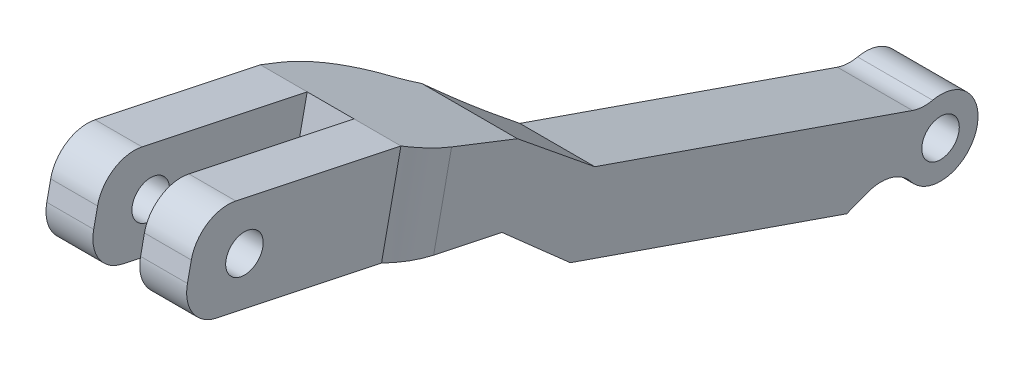
ISO-10303-21;
HEADER;
FILE_DESCRIPTION(('STEP AP214'),'2;1');
FILE_NAME('part.step','',(''),(''),'','','');
FILE_SCHEMA(('AUTOMOTIVE_DESIGN { 1 0 10303 214 1 1 1 1 }'));
ENDSEC;
DATA;
#1=APPLICATION_CONTEXT('core data for automotive mechanical design processes');
#2=APPLICATION_PROTOCOL_DEFINITION('international standard','automotive_design',2000,#1);
#3=PRODUCT_CONTEXT('',#1,'mechanical');
#4=PRODUCT('Part','Part','',(#3));
#5=PRODUCT_RELATED_PRODUCT_CATEGORY('part','',(#4));
#6=PRODUCT_DEFINITION_FORMATION('','',#4);
#7=PRODUCT_DEFINITION_CONTEXT('part definition',#1,'design');
#8=PRODUCT_DEFINITION('design','',#6,#7);
#9=PRODUCT_DEFINITION_SHAPE('','',#8);
#10=(LENGTH_UNIT() NAMED_UNIT(*) SI_UNIT(.MILLI.,.METRE.));
#11=(NAMED_UNIT(*) PLANE_ANGLE_UNIT() SI_UNIT($,.RADIAN.));
#12=(NAMED_UNIT(*) SI_UNIT($,.STERADIAN.) SOLID_ANGLE_UNIT());
#13=UNCERTAINTY_MEASURE_WITH_UNIT(LENGTH_MEASURE(1.E-05),#10,'distance_accuracy_value','');
#14=(GEOMETRIC_REPRESENTATION_CONTEXT(3) GLOBAL_UNCERTAINTY_ASSIGNED_CONTEXT((#13)) GLOBAL_UNIT_ASSIGNED_CONTEXT((#10,
#11,#12)) REPRESENTATION_CONTEXT('',''));
#15=CARTESIAN_POINT('',(0.,0.,0.));
#16=DIRECTION('',(0.,0.,1.));
#17=DIRECTION('',(1.,0.,0.));
#18=AXIS2_PLACEMENT_3D('',#15,#16,#17);
#19=CARTESIAN_POINT('',(-2.,0.,0.));
#20=DIRECTION('',(1.,0.,0.));
#21=DIRECTION('',(0.,0.,-1.));
#22=AXIS2_PLACEMENT_3D('',#19,#20,#21);
#23=PLANE('',#22);
#24=CARTESIAN_POINT('',(-2.,-2.82842712474619,-2.82842712474619));
#25=DIRECTION('',(1.,0.,0.));
#26=DIRECTION('',(0.,0.,-1.));
#27=AXIS2_PLACEMENT_3D('',#24,#25,#26);
#28=CIRCLE('',#27,1.);
#29=CARTESIAN_POINT('',(-2.,-2.82842712474619,-3.82842712474619));
#30=VERTEX_POINT('',#29);
#31=EDGE_CURVE('E330',#30,#30,#28,.T.);
#32=ORIENTED_EDGE('',*,*,#31,.T.);
#33=EDGE_LOOP('',(#32));
#34=FACE_BOUND('',#33,.T.);
#35=DIRECTION('',(0.,-0.662356527479229,-0.749188781620265));
#36=VECTOR('',#35,1.);
#37=CARTESIAN_POINT('',(-2.,-7.67349571635643,6.78412451040778));
#38=LINE('',#37,#36);
#39=CARTESIAN_POINT('',(-2.,2.12208722695251,17.8638686453186));
#40=VERTEX_POINT('',#39);
#41=CARTESIAN_POINT('',(-2.,1.2824807008123,16.9141931091639));
#42=VERTEX_POINT('',#41);
#43=EDGE_CURVE('E317',#40,#42,#38,.T.);
#44=ORIENTED_EDGE('',*,*,#43,.F.);
#45=DIRECTION('',(0.,0.978329833974477,-0.207052495651398));
#46=VECTOR('',#45,1.);
#47=CARTESIAN_POINT('',(-2.,3.70958131355781,17.5278933933648));
#48=LINE('',#47,#46);
#49=CARTESIAN_POINT('',(-2.,6.19815963643702,17.0012138069079));
#50=VERTEX_POINT('',#49);
#51=EDGE_CURVE('E373',#40,#50,#48,.T.);
#52=ORIENTED_EDGE('',*,*,#51,.T.);
#53=DIRECTION('',(0.,-0.63095563709956,-0.775818911868155));
#54=VECTOR('',#53,1.);
#55=CARTESIAN_POINT('',(-2.,-4.59157734088075,3.73422400780513));
#56=LINE('',#55,#54);
#57=CARTESIAN_POINT('',(-2.,5.06180407673865,15.6039584659886));
#58=VERTEX_POINT('',#57);
#59=EDGE_CURVE('E315',#50,#58,#56,.T.);
#60=ORIENTED_EDGE('',*,*,#59,.T.);
#61=DIRECTION('',(0.,0.32755866079382,0.944830843981587));
#62=VECTOR('',#61,1.);
#63=CARTESIAN_POINT('',(-2.,-0.310531053345477,0.107656451540146));
#64=LINE('',#63,#62);
#65=CARTESIAN_POINT('',(-2.,-0.808359955364981,-1.32831260668477));
#66=VERTEX_POINT('',#65);
#67=EDGE_CURVE('E312',#66,#58,#64,.T.);
#68=ORIENTED_EDGE('',*,*,#67,.F.);
#69=CARTESIAN_POINT('',(-2.,1.08130173259819,-1.98342992827241));
#70=DIRECTION('',(1.,0.,0.));
#71=DIRECTION('',(0.,0.,-1.));
#72=AXIS2_PLACEMENT_3D('',#69,#70,#71);
#73=CIRCLE('',#72,2.);
#74=CARTESIAN_POINT('',(-2.,-0.873562696074001,-2.40592852650929));
#75=VERTEX_POINT('',#74);
#76=EDGE_CURVE('E310',#66,#75,#73,.T.);
#77=ORIENTED_EDGE('',*,*,#76,.T.);
#78=CARTESIAN_POINT('',(-2.,-2.82842712474619,-2.82842712474619));
#79=DIRECTION('',(1.,0.,0.));
#80=DIRECTION('',(0.,0.,-1.));
#81=AXIS2_PLACEMENT_3D('',#78,#79,#80);
#82=CIRCLE('',#81,2.);
#83=CARTESIAN_POINT('',(-2.,-4.04939250373779,-1.24436792657716));
#84=VERTEX_POINT('',#83);
#85=EDGE_CURVE('E327',#84,#75,#82,.T.);
#86=ORIENTED_EDGE('',*,*,#85,.F.);
#87=CARTESIAN_POINT('',(-2.,-5.2703578827294,0.339691271591866));
#88=DIRECTION('',(1.,0.,0.));
#89=DIRECTION('',(0.,0.,-1.));
#90=AXIS2_PLACEMENT_3D('',#87,#88,#89);
#91=CIRCLE('',#90,2.);
#92=CARTESIAN_POINT('',(-2.,-3.40169175008281,1.05249340732073));
#93=VERTEX_POINT('',#92);
#94=EDGE_CURVE('E325',#84,#93,#91,.T.);
#95=ORIENTED_EDGE('',*,*,#94,.T.);
#96=DIRECTION('',(0.,0.356401067864434,-0.934333066323295));
#97=VECTOR('',#96,1.);
#98=CARTESIAN_POINT('',(-2.,-2.61912554346116,-0.999064652858577));
#99=LINE('',#98,#97);
#100=CARTESIAN_POINT('',(-2.,-3.8285642774204,2.17157287525382));
#101=VERTEX_POINT('',#100);
#102=EDGE_CURVE('E322',#101,#93,#99,.T.);
#103=ORIENTED_EDGE('',*,*,#102,.F.);
#104=DIRECTION('',(0.,0.32755866079382,0.944830843981588));
#105=VECTOR('',#104,1.);
#106=CARTESIAN_POINT('',(-2.,-4.08985442927183,1.41789109471543));
#107=LINE('',#106,#105);
#108=EDGE_CURVE('E319',#101,#42,#107,.T.);
#109=ORIENTED_EDGE('',*,*,#108,.T.);
#110=EDGE_LOOP('',(#44,#52,#60,#68,#77,#86,#95,#103,#109));
#111=FACE_BOUND('',#110,.T.);
#112=ADVANCED_FACE('F39',(#34,#111),#23,.F.);
#113=CARTESIAN_POINT('',(-2.,5.5996261759702,26.4584173681224));
#114=DIRECTION('',(0.,0.207052495651399,0.978329833974477));
#115=DIRECTION('',(0.,-0.978329833974477,0.207052495651399));
#116=AXIS2_PLACEMENT_3D('',#113,#114,#115);
#117=PLANE('',#116);
#118=DIRECTION('',(1.,0.,0.));
#119=VECTOR('',#118,1.);
#120=CARTESIAN_POINT('',(-2.,5.74583297997471,26.427474344002));
#121=LINE('',#120,#119);
#122=CARTESIAN_POINT('',(-3.55,5.7458329799747,26.427474344002));
#123=VERTEX_POINT('',#122);
#124=CARTESIAN_POINT('',(-1.05,5.7458329799747,26.427474344002));
#125=VERTEX_POINT('',#124);
#126=EDGE_CURVE('E347',#123,#125,#121,.T.);
#127=ORIENTED_EDGE('',*,*,#126,.T.);
#128=DIRECTION('',(0.,0.978329833974477,-0.207052495651399));
#129=VECTOR('',#128,1.);
#130=CARTESIAN_POINT('',(-1.05,5.5996261759702,26.4584173681224));
#131=LINE('',#130,#129);
#132=CARTESIAN_POINT('',(-1.05,10.6374821498471,25.392211865745));
#133=VERTEX_POINT('',#132);
#134=EDGE_CURVE('E272',#125,#133,#131,.T.);
#135=ORIENTED_EDGE('',*,*,#134,.T.);
#136=DIRECTION('',(1.,0.,0.));
#137=VECTOR('',#136,1.);
#138=CARTESIAN_POINT('',(-2.,10.6374821498471,25.392211865745));
#139=LINE('',#138,#137);
#140=CARTESIAN_POINT('',(-3.55,10.6374821498471,25.392211865745));
#141=VERTEX_POINT('',#140);
#142=EDGE_CURVE('E350',#141,#133,#139,.T.);
#143=ORIENTED_EDGE('',*,*,#142,.F.);
#144=DIRECTION('',(0.,-0.978329833974477,0.207052495651399));
#145=VECTOR('',#144,1.);
#146=CARTESIAN_POINT('',(-3.55,5.5996261759702,26.4584173681224));
#147=LINE('',#146,#145);
#148=EDGE_CURVE('E217',#141,#123,#147,.T.);
#149=ORIENTED_EDGE('',*,*,#148,.T.);
#150=EDGE_LOOP('',(#127,#135,#143,#149));
#151=FACE_BOUND('',#150,.T.);
#152=ADVANCED_FACE('F493',(#151),#117,.T.);
#153=CARTESIAN_POINT('',(-2.,1.08130173259819,-1.98342992827241));
#154=DIRECTION('',(1.,0.,0.));
#155=DIRECTION('',(0.,0.,-1.));
#156=AXIS2_PLACEMENT_3D('',#153,#154,#155);
#157=CYLINDRICAL_SURFACE('',#156,2.);
#158=DIRECTION('',(1.,0.,0.));
#159=VECTOR('',#158,1.);
#160=CARTESIAN_POINT('',(-2.,-0.808359955364981,-1.32831260668477));
#161=LINE('',#160,#159);
#162=CARTESIAN_POINT('',(2.,-0.808359955364981,-1.32831260668477));
#163=VERTEX_POINT('',#162);
#164=EDGE_CURVE('E333',#66,#163,#161,.T.);
#165=ORIENTED_EDGE('',*,*,#164,.T.);
#166=CARTESIAN_POINT('',(2.,1.08130173259819,-1.98342992827241));
#167=DIRECTION('',(1.,0.,0.));
#168=DIRECTION('',(0.,0.,-1.));
#169=AXIS2_PLACEMENT_3D('',#166,#167,#168);
#170=CIRCLE('',#169,2.);
#171=CARTESIAN_POINT('',(2.,-0.873562696074001,-2.40592852650929));
#172=VERTEX_POINT('',#171);
#173=EDGE_CURVE('E278',#163,#172,#170,.T.);
#174=ORIENTED_EDGE('',*,*,#173,.T.);
#175=DIRECTION('',(1.,0.,0.));
#176=VECTOR('',#175,1.);
#177=CARTESIAN_POINT('',(-2.,-0.873562696074001,-2.40592852650929));
#178=LINE('',#177,#176);
#179=EDGE_CURVE('E334',#75,#172,#178,.T.);
#180=ORIENTED_EDGE('',*,*,#179,.F.);
#181=ORIENTED_EDGE('',*,*,#76,.F.);
#182=EDGE_LOOP('',(#165,#174,#180,#181));
#183=FACE_BOUND('',#182,.T.);
#184=ADVANCED_FACE('F472',(#183),#157,.F.);
#185=CARTESIAN_POINT('',(-2.,-2.82842712474619,-2.82842712474619));
#186=DIRECTION('',(1.,0.,0.));
#187=DIRECTION('',(0.,0.,-1.));
#188=AXIS2_PLACEMENT_3D('',#185,#186,#187);
#189=CYLINDRICAL_SURFACE('',#188,2.);
#190=ORIENTED_EDGE('',*,*,#179,.T.);
#191=CARTESIAN_POINT('',(2.,-2.82842712474619,-2.82842712474619));
#192=DIRECTION('',(1.,0.,0.));
#193=DIRECTION('',(0.,0.,-1.));
#194=AXIS2_PLACEMENT_3D('',#191,#192,#193);
#195=CIRCLE('',#194,2.);
#196=CARTESIAN_POINT('',(2.,-4.04939250373779,-1.24436792657716));
#197=VERTEX_POINT('',#196);
#198=EDGE_CURVE('E304',#197,#172,#195,.T.);
#199=ORIENTED_EDGE('',*,*,#198,.F.);
#200=DIRECTION('',(1.,0.,0.));
#201=VECTOR('',#200,1.);
#202=CARTESIAN_POINT('',(-2.,-4.04939250373779,-1.24436792657716));
#203=LINE('',#202,#201);
#204=EDGE_CURVE('E337',#84,#197,#203,.T.);
#205=ORIENTED_EDGE('',*,*,#204,.F.);
#206=ORIENTED_EDGE('',*,*,#85,.T.);
#207=EDGE_LOOP('',(#190,#199,#205,#206));
#208=FACE_BOUND('',#207,.T.);
#209=ADVANCED_FACE('F468',(#208),#189,.T.);
#210=CARTESIAN_POINT('',(-2.,-5.2703578827294,0.339691271591866));
#211=DIRECTION('',(1.,0.,0.));
#212=DIRECTION('',(0.,0.,-1.));
#213=AXIS2_PLACEMENT_3D('',#210,#211,#212);
#214=CYLINDRICAL_SURFACE('',#213,2.);
#215=ORIENTED_EDGE('',*,*,#204,.T.);
#216=CARTESIAN_POINT('',(2.,-5.2703578827294,0.339691271591866));
#217=DIRECTION('',(1.,0.,0.));
#218=DIRECTION('',(0.,0.,-1.));
#219=AXIS2_PLACEMENT_3D('',#216,#217,#218);
#220=CIRCLE('',#219,2.);
#221=CARTESIAN_POINT('',(2.,-3.40169175008281,1.05249340732073));
#222=VERTEX_POINT('',#221);
#223=EDGE_CURVE('E301',#197,#222,#220,.T.);
#224=ORIENTED_EDGE('',*,*,#223,.T.);
#225=DIRECTION('',(1.,0.,0.));
#226=VECTOR('',#225,1.);
#227=CARTESIAN_POINT('',(-2.,-3.40169175008281,1.05249340732073));
#228=LINE('',#227,#226);
#229=EDGE_CURVE('E339',#93,#222,#228,.T.);
#230=ORIENTED_EDGE('',*,*,#229,.F.);
#231=ORIENTED_EDGE('',*,*,#94,.F.);
#232=EDGE_LOOP('',(#215,#224,#230,#231));
#233=FACE_BOUND('',#232,.T.);
#234=ADVANCED_FACE('F463',(#233),#214,.F.);
#235=CARTESIAN_POINT('',(-2.,-2.61912554346116,-0.999064652858577));
#236=DIRECTION('',(0.,-0.934333066323295,-0.356401067864434));
#237=DIRECTION('',(0.,0.356401067864434,-0.934333066323295));
#238=AXIS2_PLACEMENT_3D('',#235,#236,#237);
#239=PLANE('',#238);
#240=ORIENTED_EDGE('',*,*,#229,.T.);
#241=DIRECTION('',(0.,0.356401067864434,-0.934333066323295));
#242=VECTOR('',#241,1.);
#243=CARTESIAN_POINT('',(2.,-2.61912554346116,-0.999064652858577));
#244=LINE('',#243,#242);
#245=CARTESIAN_POINT('',(2.,-3.8285642774204,2.17157287525382));
#246=VERTEX_POINT('',#245);
#247=EDGE_CURVE('E298',#246,#222,#244,.T.);
#248=ORIENTED_EDGE('',*,*,#247,.F.);
#249=DIRECTION('',(1.,0.,0.));
#250=VECTOR('',#249,1.);
#251=CARTESIAN_POINT('',(-2.,-3.8285642774204,2.17157287525382));
#252=LINE('',#251,#250);
#253=EDGE_CURVE('E341',#101,#246,#252,.T.);
#254=ORIENTED_EDGE('',*,*,#253,.F.);
#255=ORIENTED_EDGE('',*,*,#102,.T.);
#256=EDGE_LOOP('',(#240,#248,#254,#255));
#257=FACE_BOUND('',#256,.T.);
#258=ADVANCED_FACE('F459',(#257),#239,.T.);
#259=CARTESIAN_POINT('',(-2.,-4.08985442927183,1.41789109471543));
#260=DIRECTION('',(0.,0.944830843981588,-0.32755866079382));
#261=DIRECTION('',(0.,0.32755866079382,0.944830843981588));
#262=AXIS2_PLACEMENT_3D('',#259,#260,#261);
#263=PLANE('',#262);
#264=ORIENTED_EDGE('',*,*,#253,.T.);
#265=DIRECTION('',(0.,0.32755866079382,0.944830843981588));
#266=VECTOR('',#265,1.);
#267=CARTESIAN_POINT('',(2.,-4.08985442927183,1.41789109471543));
#268=LINE('',#267,#266);
#269=CARTESIAN_POINT('',(2.,1.2824807008123,16.9141931091639));
#270=VERTEX_POINT('',#269);
#271=EDGE_CURVE('E295',#246,#270,#268,.T.);
#272=ORIENTED_EDGE('',*,*,#271,.T.);
#273=DIRECTION('',(1.,0.,0.));
#274=VECTOR('',#273,1.);
#275=CARTESIAN_POINT('',(-2.,1.2824807008123,16.9141931091639));
#276=LINE('',#275,#274);
#277=EDGE_CURVE('E343',#42,#270,#276,.T.);
#278=ORIENTED_EDGE('',*,*,#277,.F.);
#279=ORIENTED_EDGE('',*,*,#108,.F.);
#280=EDGE_LOOP('',(#264,#272,#278,#279));
#281=FACE_BOUND('',#280,.T.);
#282=ADVANCED_FACE('F454',(#281),#263,.F.);
#283=CARTESIAN_POINT('',(-2.,-7.67349571635643,6.78412451040778));
#284=DIRECTION('',(0.,-0.749188781620265,0.662356527479229));
#285=DIRECTION('',(0.,-0.662356527479229,-0.749188781620265));
#286=AXIS2_PLACEMENT_3D('',#283,#284,#285);
#287=PLANE('',#286);
#288=ORIENTED_EDGE('',*,*,#277,.T.);
#289=DIRECTION('',(0.,-0.662356527479229,-0.749188781620265));
#290=VECTOR('',#289,1.);
#291=CARTESIAN_POINT('',(2.,-7.67349571635643,6.78412451040778));
#292=LINE('',#291,#290);
#293=CARTESIAN_POINT('',(2.,4.50351800606632,20.5574953401551));
#294=VERTEX_POINT('',#293);
#295=EDGE_CURVE('E292',#294,#270,#292,.T.);
#296=ORIENTED_EDGE('',*,*,#295,.F.);
#297=DIRECTION('',(1.,0.,0.));
#298=VECTOR('',#297,1.);
#299=CARTESIAN_POINT('',(-2.,4.50351800606632,20.5574953401551));
#300=LINE('',#299,#298);
#301=CARTESIAN_POINT('',(-3.09954996537938,4.50351800606632,20.5574953401551));
#302=VERTEX_POINT('',#301);
#303=EDGE_CURVE('E345',#302,#294,#300,.T.);
#304=ORIENTED_EDGE('',*,*,#303,.F.);
#305=CARTESIAN_POINT('',(-7.,2.12208722695251,17.8638686453186));
#306=DIRECTION('',(0.,-0.749188781620265,0.662356527479229));
#307=DIRECTION('',(0.,0.662356527479229,0.749188781620265));
#308=AXIS2_PLACEMENT_3D('',#305,#306,#307);
#309=ELLIPSE('',#308,5.74649030450801,5.);
#310=EDGE_CURVE('E378',#302,#40,#309,.F.);
#311=ORIENTED_EDGE('',*,*,#310,.T.);
#312=ORIENTED_EDGE('',*,*,#43,.T.);
#313=EDGE_LOOP('',(#288,#296,#304,#311,#312));
#314=FACE_BOUND('',#313,.T.);
#315=ADVANCED_FACE('F450',(#314),#287,.T.);
#316=CARTESIAN_POINT('',(-2.,0.146206804004553,-0.0309430241203779));
#317=DIRECTION('',(0.,0.978329833974477,-0.207052495651397));
#318=DIRECTION('',(0.,0.207052495651397,0.978329833974477));
#319=AXIS2_PLACEMENT_3D('',#316,#317,#318);
#320=PLANE('',#319);
#321=DIRECTION('',(0.,0.207052495651397,0.978329833974477));
#322=VECTOR('',#321,1.);
#323=CARTESIAN_POINT('',(-3.55,0.146206804004553,-0.0309430241203779));
#324=LINE('',#323,#322);
#325=CARTESIAN_POINT('',(-3.55,7.60930544083729,35.2324428497723));
#326=VERTEX_POINT('',#325);
#327=EDGE_CURVE('E240',#123,#326,#324,.T.);
#328=ORIENTED_EDGE('',*,*,#327,.T.);
#329=DIRECTION('',(1.,0.,0.));
#330=VECTOR('',#329,1.);
#331=CARTESIAN_POINT('',(-6.05,7.60930544083729,35.2324428497723));
#332=LINE('',#331,#330);
#333=CARTESIAN_POINT('',(-6.05,7.60930544083729,35.2324428497723));
#334=VERTEX_POINT('',#333);
#335=EDGE_CURVE('E397',#326,#334,#332,.F.);
#336=ORIENTED_EDGE('',*,*,#335,.T.);
#337=DIRECTION('',(0.,0.207052495651397,0.978329833974477));
#338=VECTOR('',#337,1.);
#339=CARTESIAN_POINT('',(-6.05,0.146206804004553,-0.0309430241203779));
#340=LINE('',#339,#338);
#341=CARTESIAN_POINT('',(-6.05,5.5199222365214,25.3600386705492));
#342=VERTEX_POINT('',#341);
#343=EDGE_CURVE('E236',#342,#334,#340,.T.);
#344=ORIENTED_EDGE('',*,*,#343,.F.);
#345=CARTESIAN_POINT('',(-1.05,5.5199222365214,25.3600386705492));
#346=DIRECTION('',(0.,0.978329833974477,-0.207052495651397));
#347=DIRECTION('',(0.,0.207052495651397,0.978329833974477));
#348=AXIS2_PLACEMENT_3D('',#345,#346,#347);
#349=CIRCLE('',#348,5.);
#350=CARTESIAN_POINT('',(-4.025,4.68785517704188,21.4284945198968));
#351=VERTEX_POINT('',#350);
#352=EDGE_CURVE('E366',#342,#351,#349,.F.);
#353=ORIENTED_EDGE('',*,*,#352,.T.);
#354=CARTESIAN_POINT('',(-7.,3.85578811756236,17.4969503692444));
#355=DIRECTION('',(0.,0.978329833974477,-0.207052495651397));
#356=DIRECTION('',(0.,0.207052495651397,0.978329833974477));
#357=AXIS2_PLACEMENT_3D('',#354,#355,#356);
#358=CIRCLE('',#357,5.);
#359=EDGE_CURVE('E375',#351,#302,#358,.T.);
#360=ORIENTED_EDGE('',*,*,#359,.T.);
#361=ORIENTED_EDGE('',*,*,#303,.T.);
#362=DIRECTION('',(0.,0.207052495651397,0.978329833974477));
#363=VECTOR('',#362,1.);
#364=CARTESIAN_POINT('',(2.,0.146206804004553,-0.0309430241203779));
#365=LINE('',#364,#363);
#366=CARTESIAN_POINT('',(2.,5.27379415728258,24.197075422313));
#367=VERTEX_POINT('',#366);
#368=EDGE_CURVE('E289',#294,#367,#365,.T.);
#369=ORIENTED_EDGE('',*,*,#368,.T.);
#370=CARTESIAN_POINT('',(-3.,5.27379415728258,24.197075422313));
#371=DIRECTION('',(0.,0.978329833974477,-0.207052495651397));
#372=DIRECTION('',(0.,0.207052495651397,0.978329833974477));
#373=AXIS2_PLACEMENT_3D('',#370,#371,#372);
#374=CIRCLE('',#373,5.);
#375=CARTESIAN_POINT('',(1.45,5.7458329799747,26.427474344002));
#376=VERTEX_POINT('',#375);
#377=EDGE_CURVE('E360',#367,#376,#374,.F.);
#378=ORIENTED_EDGE('',*,*,#377,.T.);
#379=DIRECTION('',(0.,0.207052495651397,0.978329833974477));
#380=VECTOR('',#379,1.);
#381=CARTESIAN_POINT('',(1.45,0.146206804004553,-0.0309430241203779));
#382=LINE('',#381,#380);
#383=CARTESIAN_POINT('',(1.45,7.60930544083728,35.2324428497723));
#384=VERTEX_POINT('',#383);
#385=EDGE_CURVE('E251',#376,#384,#382,.T.);
#386=ORIENTED_EDGE('',*,*,#385,.T.);
#387=DIRECTION('',(-1.,0.,0.));
#388=VECTOR('',#387,1.);
#389=CARTESIAN_POINT('',(-2.,7.60930544083728,35.2324428497723));
#390=LINE('',#389,#388);
#391=CARTESIAN_POINT('',(-1.05,7.60930544083728,35.2324428497723));
#392=VERTEX_POINT('',#391);
#393=EDGE_CURVE('E394',#384,#392,#390,.T.);
#394=ORIENTED_EDGE('',*,*,#393,.T.);
#395=DIRECTION('',(0.,0.207052495651397,0.978329833974477));
#396=VECTOR('',#395,1.);
#397=CARTESIAN_POINT('',(-1.05,0.146206804004553,-0.0309430241203779));
#398=LINE('',#397,#396);
#399=EDGE_CURVE('E250',#125,#392,#398,.T.);
#400=ORIENTED_EDGE('',*,*,#399,.F.);
#401=ORIENTED_EDGE('',*,*,#126,.F.);
#402=EDGE_LOOP('',(#328,#336,#344,#353,#360,#361,#369,#378,#386,#394,#400,#401));
#403=FACE_BOUND('',#402,.T.);
#404=ADVANCED_FACE('F422',(#403),#320,.F.);
#405=CARTESIAN_POINT('',(-2.,0.58958659493355,-0.23119890553793));
#406=DIRECTION('',(0.,-0.930979383131998,0.365071757580842));
#407=DIRECTION('',(0.,-0.365071757580842,-0.930979383131998));
#408=AXIS2_PLACEMENT_3D('',#405,#406,#407);
#409=PLANE('',#408);
#410=DIRECTION('',(1.,0.,0.));
#411=VECTOR('',#410,1.);
#412=CARTESIAN_POINT('',(-2.,8.41683734196423,19.7292853575495));
#413=LINE('',#412,#411);
#414=CARTESIAN_POINT('',(-3.09954996537938,8.41683734196423,19.7292853575495));
#415=VERTEX_POINT('',#414);
#416=CARTESIAN_POINT('',(2.,8.41683734196423,19.7292853575495));
#417=VERTEX_POINT('',#416);
#418=EDGE_CURVE('E352',#415,#417,#413,.T.);
#419=ORIENTED_EDGE('',*,*,#418,.F.);
#420=CARTESIAN_POINT('',(-7.,7.25901662497515,16.7766953680562));
#421=DIRECTION('',(0.,-0.930979383131998,0.365071757580842));
#422=DIRECTION('',(0.,0.365071757580842,0.930979383131998));
#423=AXIS2_PLACEMENT_3D('',#420,#421,#422);
#424=ELLIPSE('',#423,5.06896877524852,5.);
#425=CARTESIAN_POINT('',(-4.025,8.74634104289674,20.569561675462));
#426=VERTEX_POINT('',#425);
#427=EDGE_CURVE('E383',#415,#426,#424,.T.);
#428=ORIENTED_EDGE('',*,*,#427,.T.);
#429=CARTESIAN_POINT('',(-1.05,10.2336654608183,24.3624279828678));
#430=DIRECTION('',(0.,-0.930979383131998,0.365071757580842));
#431=DIRECTION('',(0.,0.365071757580842,0.930979383131998));
#432=AXIS2_PLACEMENT_3D('',#429,#430,#431);
#433=ELLIPSE('',#432,5.06896877524852,5.);
#434=CARTESIAN_POINT('',(-6.05,10.2336654608183,24.3624279828678));
#435=VERTEX_POINT('',#434);
#436=EDGE_CURVE('E223',#426,#435,#433,.F.);
#437=ORIENTED_EDGE('',*,*,#436,.T.);
#438=DIRECTION('',(0.,-0.365071757580842,-0.930979383131998));
#439=VECTOR('',#438,1.);
#440=CARTESIAN_POINT('',(-6.05,0.58958659493355,-0.23119890553793));
#441=LINE('',#440,#439);
#442=CARTESIAN_POINT('',(-6.05,10.6374821498471,25.392211865745));
#443=VERTEX_POINT('',#442);
#444=EDGE_CURVE('E218',#443,#435,#441,.T.);
#445=ORIENTED_EDGE('',*,*,#444,.F.);
#446=DIRECTION('',(1.,0.,0.));
#447=VECTOR('',#446,1.);
#448=CARTESIAN_POINT('',(-6.05,10.6374821498471,25.392211865745));
#449=LINE('',#448,#447);
#450=EDGE_CURVE('E206',#443,#141,#449,.T.);
#451=ORIENTED_EDGE('',*,*,#450,.T.);
#452=ORIENTED_EDGE('',*,*,#142,.T.);
#453=DIRECTION('',(-1.,0.,0.));
#454=VECTOR('',#453,1.);
#455=CARTESIAN_POINT('',(1.45,10.6374821498471,25.392211865745));
#456=LINE('',#455,#454);
#457=CARTESIAN_POINT('',(1.45,10.6374821498471,25.392211865745));
#458=VERTEX_POINT('',#457);
#459=EDGE_CURVE('E262',#458,#133,#456,.T.);
#460=ORIENTED_EDGE('',*,*,#459,.F.);
#461=CARTESIAN_POINT('',(-3.,9.79371017354013,23.2404860811713));
#462=DIRECTION('',(0.,-0.930979383131998,0.365071757580842));
#463=DIRECTION('',(0.,0.365071757580842,0.930979383131998));
#464=AXIS2_PLACEMENT_3D('',#461,#462,#463);
#465=ELLIPSE('',#464,5.06896877524851,5.);
#466=CARTESIAN_POINT('',(2.,9.79371017354013,23.2404860811713));
#467=VERTEX_POINT('',#466);
#468=EDGE_CURVE('E362',#458,#467,#465,.F.);
#469=ORIENTED_EDGE('',*,*,#468,.T.);
#470=DIRECTION('',(0.,-0.365071757580842,-0.930979383131998));
#471=VECTOR('',#470,1.);
#472=CARTESIAN_POINT('',(2.,0.58958659493355,-0.23119890553793));
#473=LINE('',#472,#471);
#474=EDGE_CURVE('E287',#467,#417,#473,.T.);
#475=ORIENTED_EDGE('',*,*,#474,.T.);
#476=EDGE_LOOP('',(#419,#428,#437,#445,#451,#452,#460,#469,#475));
#477=FACE_BOUND('',#476,.T.);
#478=ADVANCED_FACE('F221',(#477),#409,.F.);
#479=CARTESIAN_POINT('',(-2.,-4.59157734088075,3.73422400780513));
#480=DIRECTION('',(0.,-0.775818911868155,0.63095563709956));
#481=DIRECTION('',(0.,-0.63095563709956,-0.775818911868155));
#482=AXIS2_PLACEMENT_3D('',#479,#480,#481);
#483=PLANE('',#482);
#484=ORIENTED_EDGE('',*,*,#418,.T.);
#485=DIRECTION('',(0.,-0.63095563709956,-0.775818911868155));
#486=VECTOR('',#485,1.);
#487=CARTESIAN_POINT('',(2.,-4.59157734088075,3.73422400780513));
#488=LINE('',#487,#486);
#489=CARTESIAN_POINT('',(2.,5.06180407673865,15.6039584659886));
#490=VERTEX_POINT('',#489);
#491=EDGE_CURVE('E284',#417,#490,#488,.T.);
#492=ORIENTED_EDGE('',*,*,#491,.T.);
#493=DIRECTION('',(1.,0.,0.));
#494=VECTOR('',#493,1.);
#495=CARTESIAN_POINT('',(-2.,5.06180407673865,15.6039584659886));
#496=LINE('',#495,#494);
#497=EDGE_CURVE('E355',#58,#490,#496,.T.);
#498=ORIENTED_EDGE('',*,*,#497,.F.);
#499=ORIENTED_EDGE('',*,*,#59,.F.);
#500=CARTESIAN_POINT('',(-7.,6.19815963643702,17.0012138069079));
#501=DIRECTION('',(0.,-0.775818911868155,0.63095563709956));
#502=DIRECTION('',(0.,0.63095563709956,0.775818911868155));
#503=AXIS2_PLACEMENT_3D('',#500,#501,#502);
#504=ELLIPSE('',#503,5.6202020763828,5.);
#505=EDGE_CURVE('E380',#50,#415,#504,.T.);
#506=ORIENTED_EDGE('',*,*,#505,.T.);
#507=EDGE_LOOP('',(#484,#492,#498,#499,#506));
#508=FACE_BOUND('',#507,.T.);
#509=ADVANCED_FACE('F480',(#508),#483,.F.);
#510=CARTESIAN_POINT('',(-2.,-0.310531053345477,0.107656451540146));
#511=DIRECTION('',(0.,0.944830843981587,-0.32755866079382));
#512=DIRECTION('',(0.,0.32755866079382,0.944830843981587));
#513=AXIS2_PLACEMENT_3D('',#510,#511,#512);
#514=PLANE('',#513);
#515=ORIENTED_EDGE('',*,*,#497,.T.);
#516=DIRECTION('',(0.,0.32755866079382,0.944830843981587));
#517=VECTOR('',#516,1.);
#518=CARTESIAN_POINT('',(2.,-0.310531053345477,0.107656451540146));
#519=LINE('',#518,#517);
#520=EDGE_CURVE('E281',#163,#490,#519,.T.);
#521=ORIENTED_EDGE('',*,*,#520,.F.);
#522=ORIENTED_EDGE('',*,*,#164,.F.);
#523=ORIENTED_EDGE('',*,*,#67,.T.);
#524=EDGE_LOOP('',(#515,#521,#522,#523));
#525=FACE_BOUND('',#524,.T.);
#526=ADVANCED_FACE('F477',(#525),#514,.T.);
#527=CARTESIAN_POINT('',(-2.,-2.82842712474619,-2.82842712474619));
#528=DIRECTION('',(1.,0.,0.));
#529=DIRECTION('',(0.,0.,-1.));
#530=AXIS2_PLACEMENT_3D('',#527,#528,#529);
#531=CYLINDRICAL_SURFACE('',#530,1.);
#532=ORIENTED_EDGE('',*,*,#31,.F.);
#533=EDGE_LOOP('',(#532));
#534=FACE_BOUND('',#533,.T.);
#535=CARTESIAN_POINT('',(2.,-2.82842712474619,-2.82842712474619));
#536=DIRECTION('',(1.,0.,0.));
#537=DIRECTION('',(0.,0.,-1.));
#538=AXIS2_PLACEMENT_3D('',#535,#536,#537);
#539=CIRCLE('',#538,1.);
#540=CARTESIAN_POINT('',(2.,-2.82842712474619,-3.82842712474619));
#541=VERTEX_POINT('',#540);
#542=EDGE_CURVE('E307',#541,#541,#539,.T.);
#543=ORIENTED_EDGE('',*,*,#542,.T.);
#544=EDGE_LOOP('',(#543));
#545=FACE_BOUND('',#544,.T.);
#546=ADVANCED_FACE('F504',(#534,#545),#531,.F.);
#547=CARTESIAN_POINT('',(2.,0.,0.));
#548=DIRECTION('',(1.,0.,0.));
#549=DIRECTION('',(0.,0.,-1.));
#550=AXIS2_PLACEMENT_3D('',#547,#548,#549);
#551=PLANE('',#550);
#552=ORIENTED_EDGE('',*,*,#474,.F.);
#553=DIRECTION('',(0.,-0.978329833974477,0.207052495651399));
#554=VECTOR('',#553,1.);
#555=CARTESIAN_POINT('',(2.,5.27379415728258,24.197075422313));
#556=LINE('',#555,#554);
#557=EDGE_CURVE('E336',#467,#367,#556,.T.);
#558=ORIENTED_EDGE('',*,*,#557,.T.);
#559=ORIENTED_EDGE('',*,*,#368,.F.);
#560=ORIENTED_EDGE('',*,*,#295,.T.);
#561=ORIENTED_EDGE('',*,*,#271,.F.);
#562=ORIENTED_EDGE('',*,*,#247,.T.);
#563=ORIENTED_EDGE('',*,*,#223,.F.);
#564=ORIENTED_EDGE('',*,*,#198,.T.);
#565=ORIENTED_EDGE('',*,*,#173,.F.);
#566=ORIENTED_EDGE('',*,*,#520,.T.);
#567=ORIENTED_EDGE('',*,*,#491,.F.);
#568=EDGE_LOOP('',(#552,#558,#559,#560,#561,#562,#563,#564,#565,#566,#567));
#569=FACE_BOUND('',#568,.T.);
#570=ORIENTED_EDGE('',*,*,#542,.F.);
#571=EDGE_LOOP('',(#570));
#572=FACE_BOUND('',#571,.T.);
#573=ADVANCED_FACE('F444',(#569,#572),#551,.T.);
#574=CARTESIAN_POINT('',(1.45,5.03785597387695,-1.06620550237737));
#575=DIRECTION('',(0.,-0.978329833974477,0.207052495651397));
#576=DIRECTION('',(0.,-0.207052495651397,-0.978329833974477));
#577=AXIS2_PLACEMENT_3D('',#574,#575,#576);
#578=PLANE('',#577);
#579=DIRECTION('',(0.,0.207052495651397,0.978329833974477));
#580=VECTOR('',#579,1.);
#581=CARTESIAN_POINT('',(-1.05,5.03785597387695,-1.06620550237737));
#582=LINE('',#581,#580);
#583=CARTESIAN_POINT('',(-1.05,12.5009546107097,34.1971803715153));
#584=VERTEX_POINT('',#583);
#585=EDGE_CURVE('E265',#133,#584,#582,.T.);
#586=ORIENTED_EDGE('',*,*,#585,.T.);
#587=DIRECTION('',(-1.,0.,0.));
#588=VECTOR('',#587,1.);
#589=CARTESIAN_POINT('',(1.45,12.5009546107097,34.1971803715153));
#590=LINE('',#589,#588);
#591=CARTESIAN_POINT('',(1.45,12.5009546107097,34.1971803715153));
#592=VERTEX_POINT('',#591);
#593=EDGE_CURVE('E47',#584,#592,#590,.F.);
#594=ORIENTED_EDGE('',*,*,#593,.T.);
#595=DIRECTION('',(0.,0.207052495651397,0.978329833974477));
#596=VECTOR('',#595,1.);
#597=CARTESIAN_POINT('',(1.45,5.03785597387695,-1.06620550237737));
#598=LINE('',#597,#596);
#599=EDGE_CURVE('E254',#458,#592,#598,.T.);
#600=ORIENTED_EDGE('',*,*,#599,.F.);
#601=ORIENTED_EDGE('',*,*,#459,.T.);
#602=EDGE_LOOP('',(#586,#594,#600,#601));
#603=FACE_BOUND('',#602,.T.);
#604=ADVANCED_FACE('F435',(#603),#578,.F.);
#605=CARTESIAN_POINT('',(1.45,7.87720362813556,37.2200455418416));
#606=DIRECTION('',(0.,-0.207052495651398,-0.978329833974477));
#607=DIRECTION('',(0.,0.978329833974477,-0.207052495651398));
#608=AXIS2_PLACEMENT_3D('',#605,#606,#607);
#609=PLANE('',#608);
#610=DIRECTION('',(0.,-0.978329833974477,0.207052495651398));
#611=VECTOR('',#610,1.);
#612=CARTESIAN_POINT('',(-1.05,7.87720362813556,37.2200455418416));
#613=LINE('',#612,#611);
#614=CARTESIAN_POINT('',(-1.05,10.9583999340635,36.5679450307671));
#615=VERTEX_POINT('',#614);
#616=CARTESIAN_POINT('',(-1.05,9.98007010008904,36.7749975264185));
#617=VERTEX_POINT('',#616);
#618=EDGE_CURVE('E267',#615,#617,#613,.T.);
#619=ORIENTED_EDGE('',*,*,#618,.T.);
#620=DIRECTION('',(-1.,0.,0.));
#621=VECTOR('',#620,1.);
#622=CARTESIAN_POINT('',(1.45,9.98007010008904,36.7749975264185));
#623=LINE('',#622,#621);
#624=CARTESIAN_POINT('',(1.45,9.98007010008904,36.7749975264185));
#625=VERTEX_POINT('',#624);
#626=EDGE_CURVE('E61',#617,#625,#623,.F.);
#627=ORIENTED_EDGE('',*,*,#626,.T.);
#628=DIRECTION('',(0.,-0.978329833974477,0.207052495651398));
#629=VECTOR('',#628,1.);
#630=CARTESIAN_POINT('',(1.45,7.87720362813556,37.2200455418416));
#631=LINE('',#630,#629);
#632=CARTESIAN_POINT('',(1.45,10.9583999340635,36.5679450307671));
#633=VERTEX_POINT('',#632);
#634=EDGE_CURVE('E257',#633,#625,#631,.T.);
#635=ORIENTED_EDGE('',*,*,#634,.F.);
#636=DIRECTION('',(-1.,0.,0.));
#637=VECTOR('',#636,1.);
#638=CARTESIAN_POINT('',(1.45,10.9583999340635,36.5679450307671));
#639=LINE('',#638,#637);
#640=EDGE_CURVE('E406',#633,#615,#639,.T.);
#641=ORIENTED_EDGE('',*,*,#640,.T.);
#642=EDGE_LOOP('',(#619,#627,#635,#641));
#643=FACE_BOUND('',#642,.T.);
#644=ADVANCED_FACE('F429',(#643),#609,.F.);
#645=CARTESIAN_POINT('',(1.45,9.84807753012208,33.7364817766693));
#646=DIRECTION('',(-1.,0.,0.));
#647=DIRECTION('',(0.,0.,1.));
#648=AXIS2_PLACEMENT_3D('',#645,#646,#647);
#649=CYLINDRICAL_SURFACE('',#648,0.999999999999998);
#650=CARTESIAN_POINT('',(1.45,9.84807753012208,33.7364817766693));
#651=DIRECTION('',(1.,0.,0.));
#652=DIRECTION('',(0.,0.,-1.));
#653=AXIS2_PLACEMENT_3D('',#650,#651,#652);
#654=CIRCLE('',#653,0.999999999999998);
#655=CARTESIAN_POINT('',(1.45,9.84807753012208,32.7364817766693));
#656=VERTEX_POINT('',#655);
#657=EDGE_CURVE('E259',#656,#656,#654,.T.);
#658=ORIENTED_EDGE('',*,*,#657,.T.);
#659=EDGE_LOOP('',(#658));
#660=FACE_BOUND('',#659,.T.);
#661=CARTESIAN_POINT('',(-1.05,9.84807753012208,33.7364817766693));
#662=DIRECTION('',(1.,0.,0.));
#663=DIRECTION('',(0.,0.,-1.));
#664=AXIS2_PLACEMENT_3D('',#661,#662,#663);
#665=CIRCLE('',#664,0.999999999999998);
#666=CARTESIAN_POINT('',(-1.05,9.84807753012208,32.7364817766693));
#667=VERTEX_POINT('',#666);
#668=EDGE_CURVE('E255',#667,#667,#665,.T.);
#669=ORIENTED_EDGE('',*,*,#668,.F.);
#670=EDGE_LOOP('',(#669));
#671=FACE_BOUND('',#670,.T.);
#672=ADVANCED_FACE('F570',(#660,#671),#649,.F.);
#673=CARTESIAN_POINT('',(1.45,0.,0.));
#674=DIRECTION('',(1.,0.,0.));
#675=DIRECTION('',(0.,0.,-1.));
#676=AXIS2_PLACEMENT_3D('',#673,#674,#675);
#677=PLANE('',#676);
#678=ORIENTED_EDGE('',*,*,#634,.T.);
#679=CARTESIAN_POINT('',(1.45,9.56596510878624,34.8183378584695));
#680=DIRECTION('',(1.,0.,0.));
#681=DIRECTION('',(0.,0.,-1.));
#682=AXIS2_PLACEMENT_3D('',#679,#680,#681);
#683=CIRCLE('',#682,2.);
#684=EDGE_CURVE('E412',#625,#384,#683,.T.);
#685=ORIENTED_EDGE('',*,*,#684,.T.);
#686=ORIENTED_EDGE('',*,*,#385,.F.);
#687=DIRECTION('',(0.,0.978329833974477,-0.207052495651399));
#688=VECTOR('',#687,1.);
#689=CARTESIAN_POINT('',(1.45,5.5996261759702,26.4584173681224));
#690=LINE('',#689,#688);
#691=EDGE_CURVE('E275',#376,#458,#690,.T.);
#692=ORIENTED_EDGE('',*,*,#691,.T.);
#693=ORIENTED_EDGE('',*,*,#599,.T.);
#694=CARTESIAN_POINT('',(1.45,10.5442949427607,34.6112853628181));
#695=DIRECTION('',(1.,0.,0.));
#696=DIRECTION('',(0.,0.,-1.));
#697=AXIS2_PLACEMENT_3D('',#694,#695,#696);
#698=CIRCLE('',#697,2.);
#699=EDGE_CURVE('E410',#592,#633,#698,.T.);
#700=ORIENTED_EDGE('',*,*,#699,.T.);
#701=EDGE_LOOP('',(#678,#685,#686,#692,#693,#700));
#702=FACE_BOUND('',#701,.T.);
#703=ORIENTED_EDGE('',*,*,#657,.F.);
#704=EDGE_LOOP('',(#703));
#705=FACE_BOUND('',#704,.T.);
#706=ADVANCED_FACE('F416',(#702,#705),#677,.T.);
#707=CARTESIAN_POINT('',(-1.05,0.,0.));
#708=DIRECTION('',(1.,0.,0.));
#709=DIRECTION('',(0.,0.,-1.));
#710=AXIS2_PLACEMENT_3D('',#707,#708,#709);
#711=PLANE('',#710);
#712=ORIENTED_EDGE('',*,*,#399,.T.);
#713=CARTESIAN_POINT('',(-1.05,9.56596510878624,34.8183378584695));
#714=DIRECTION('',(1.,0.,0.));
#715=DIRECTION('',(0.,0.,-1.));
#716=AXIS2_PLACEMENT_3D('',#713,#714,#715);
#717=CIRCLE('',#716,2.);
#718=EDGE_CURVE('E404',#392,#617,#717,.F.);
#719=ORIENTED_EDGE('',*,*,#718,.T.);
#720=ORIENTED_EDGE('',*,*,#618,.F.);
#721=CARTESIAN_POINT('',(-1.05,10.5442949427607,34.6112853628181));
#722=DIRECTION('',(1.,0.,0.));
#723=DIRECTION('',(0.,0.,-1.));
#724=AXIS2_PLACEMENT_3D('',#721,#722,#723);
#725=CIRCLE('',#724,2.);
#726=EDGE_CURVE('E402',#615,#584,#725,.F.);
#727=ORIENTED_EDGE('',*,*,#726,.T.);
#728=ORIENTED_EDGE('',*,*,#585,.F.);
#729=ORIENTED_EDGE('',*,*,#134,.F.);
#730=EDGE_LOOP('',(#712,#719,#720,#727,#728,#729));
#731=FACE_BOUND('',#730,.T.);
#732=ORIENTED_EDGE('',*,*,#668,.T.);
#733=EDGE_LOOP('',(#732));
#734=FACE_BOUND('',#733,.T.);
#735=ADVANCED_FACE('F427',(#731,#734),#711,.F.);
#736=CARTESIAN_POINT('',(-3.55,0.,0.));
#737=DIRECTION('',(1.,0.,0.));
#738=DIRECTION('',(0.,0.,-1.));
#739=AXIS2_PLACEMENT_3D('',#736,#737,#738);
#740=PLANE('',#739);
#741=CARTESIAN_POINT('',(-3.55,9.84807753012208,33.7364817766693));
#742=DIRECTION('',(1.,0.,0.));
#743=DIRECTION('',(0.,0.,-1.));
#744=AXIS2_PLACEMENT_3D('',#741,#742,#743);
#745=CIRCLE('',#744,0.999999999999998);
#746=CARTESIAN_POINT('',(-3.55,9.84807753012208,32.7364817766693));
#747=VERTEX_POINT('',#746);
#748=EDGE_CURVE('E872',#747,#747,#745,.T.);
#749=ORIENTED_EDGE('',*,*,#748,.F.);
#750=EDGE_LOOP('',(#749));
#751=FACE_BOUND('',#750,.T.);
#752=DIRECTION('',(0.,-0.978329833974477,0.207052495651398));
#753=VECTOR('',#752,1.);
#754=CARTESIAN_POINT('',(-3.55,7.87720362813556,37.2200455418416));
#755=LINE('',#754,#753);
#756=CARTESIAN_POINT('',(-3.55,10.9583999340635,36.5679450307671));
#757=VERTEX_POINT('',#756);
#758=CARTESIAN_POINT('',(-3.55,9.98007010008904,36.7749975264185));
#759=VERTEX_POINT('',#758);
#760=EDGE_CURVE('E243',#757,#759,#755,.T.);
#761=ORIENTED_EDGE('',*,*,#760,.T.);
#762=CARTESIAN_POINT('',(-3.55,9.56596510878624,34.8183378584695));
#763=DIRECTION('',(1.,0.,0.));
#764=DIRECTION('',(0.,0.,-1.));
#765=AXIS2_PLACEMENT_3D('',#762,#763,#764);
#766=CIRCLE('',#765,2.);
#767=EDGE_CURVE('E392',#759,#326,#766,.T.);
#768=ORIENTED_EDGE('',*,*,#767,.T.);
#769=ORIENTED_EDGE('',*,*,#327,.F.);
#770=ORIENTED_EDGE('',*,*,#148,.F.);
#771=DIRECTION('',(0.,0.207052495651397,0.978329833974477));
#772=VECTOR('',#771,1.);
#773=CARTESIAN_POINT('',(-3.55,5.03785597387694,-1.06620550237737));
#774=LINE('',#773,#772);
#775=CARTESIAN_POINT('',(-3.55,12.5009546107097,34.1971803715153));
#776=VERTEX_POINT('',#775);
#777=EDGE_CURVE('E213',#141,#776,#774,.T.);
#778=ORIENTED_EDGE('',*,*,#777,.T.);
#779=CARTESIAN_POINT('',(-3.55,10.5442949427607,34.6112853628181));
#780=DIRECTION('',(1.,0.,0.));
#781=DIRECTION('',(0.,0.,-1.));
#782=AXIS2_PLACEMENT_3D('',#779,#780,#781);
#783=CIRCLE('',#782,2.);
#784=EDGE_CURVE('E390',#776,#757,#783,.T.);
#785=ORIENTED_EDGE('',*,*,#784,.T.);
#786=EDGE_LOOP('',(#761,#768,#769,#770,#778,#785));
#787=FACE_BOUND('',#786,.T.);
#788=ADVANCED_FACE('F549',(#751,#787),#740,.T.);
#789=CARTESIAN_POINT('',(-6.05,7.87720362813556,37.2200455418416));
#790=DIRECTION('',(0.,0.207052495651398,0.978329833974477));
#791=DIRECTION('',(0.,-0.978329833974477,0.207052495651398));
#792=AXIS2_PLACEMENT_3D('',#789,#790,#791);
#793=PLANE('',#792);
#794=DIRECTION('',(0.,-0.978329833974477,0.207052495651398));
#795=VECTOR('',#794,1.);
#796=CARTESIAN_POINT('',(-6.05,7.87720362813556,37.2200455418416));
#797=LINE('',#796,#795);
#798=CARTESIAN_POINT('',(-6.05,10.9583999340635,36.5679450307671));
#799=VERTEX_POINT('',#798);
#800=CARTESIAN_POINT('',(-6.05,9.98007010008904,36.7749975264185));
#801=VERTEX_POINT('',#800);
#802=EDGE_CURVE('E233',#799,#801,#797,.T.);
#803=ORIENTED_EDGE('',*,*,#802,.T.);
#804=DIRECTION('',(1.,0.,0.));
#805=VECTOR('',#804,1.);
#806=CARTESIAN_POINT('',(-3.55,9.98007010008904,36.7749975264185));
#807=LINE('',#806,#805);
#808=EDGE_CURVE('E387',#801,#759,#807,.T.);
#809=ORIENTED_EDGE('',*,*,#808,.T.);
#810=ORIENTED_EDGE('',*,*,#760,.F.);
#811=DIRECTION('',(1.,0.,0.));
#812=VECTOR('',#811,1.);
#813=CARTESIAN_POINT('',(-6.05,10.9583999340635,36.5679450307671));
#814=LINE('',#813,#812);
#815=EDGE_CURVE('E385',#757,#799,#814,.F.);
#816=ORIENTED_EDGE('',*,*,#815,.T.);
#817=EDGE_LOOP('',(#803,#809,#810,#816));
#818=FACE_BOUND('',#817,.T.);
#819=ADVANCED_FACE('F557',(#818),#793,.T.);
#820=CARTESIAN_POINT('',(-6.05,5.03785597387694,-1.06620550237737));
#821=DIRECTION('',(0.,0.978329833974477,-0.207052495651397));
#822=DIRECTION('',(0.,0.207052495651397,0.978329833974477));
#823=AXIS2_PLACEMENT_3D('',#820,#821,#822);
#824=PLANE('',#823);
#825=DIRECTION('',(0.,0.207052495651397,0.978329833974477));
#826=VECTOR('',#825,1.);
#827=CARTESIAN_POINT('',(-6.05,5.03785597387694,-1.06620550237737));
#828=LINE('',#827,#826);
#829=CARTESIAN_POINT('',(-6.05,12.5009546107097,34.1971803715153));
#830=VERTEX_POINT('',#829);
#831=EDGE_CURVE('E210',#443,#830,#828,.T.);
#832=ORIENTED_EDGE('',*,*,#831,.T.);
#833=DIRECTION('',(1.,0.,0.));
#834=VECTOR('',#833,1.);
#835=CARTESIAN_POINT('',(-6.05,12.5009546107097,34.1971803715153));
#836=LINE('',#835,#834);
#837=EDGE_CURVE('E11',#830,#776,#836,.T.);
#838=ORIENTED_EDGE('',*,*,#837,.T.);
#839=ORIENTED_EDGE('',*,*,#777,.F.);
#840=ORIENTED_EDGE('',*,*,#450,.F.);
#841=EDGE_LOOP('',(#832,#838,#839,#840));
#842=FACE_BOUND('',#841,.T.);
#843=ADVANCED_FACE('F208',(#842),#824,.T.);
#844=CARTESIAN_POINT('',(-6.05,0.,0.));
#845=DIRECTION('',(1.,0.,0.));
#846=DIRECTION('',(0.,0.,-1.));
#847=AXIS2_PLACEMENT_3D('',#844,#845,#846);
#848=PLANE('',#847);
#849=CARTESIAN_POINT('',(-6.05,9.84807753012208,33.7364817766693));
#850=DIRECTION('',(1.,0.,0.));
#851=DIRECTION('',(0.,0.,-1.));
#852=AXIS2_PLACEMENT_3D('',#849,#850,#851);
#853=CIRCLE('',#852,0.999999999999998);
#854=CARTESIAN_POINT('',(-6.05,9.84807753012208,32.7364817766693));
#855=VERTEX_POINT('',#854);
#856=EDGE_CURVE('E244',#855,#855,#853,.T.);
#857=ORIENTED_EDGE('',*,*,#856,.T.);
#858=EDGE_LOOP('',(#857));
#859=FACE_BOUND('',#858,.T.);
#860=ORIENTED_EDGE('',*,*,#343,.T.);
#861=CARTESIAN_POINT('',(-6.05,9.56596510878624,34.8183378584695));
#862=DIRECTION('',(1.,0.,0.));
#863=DIRECTION('',(0.,0.,-1.));
#864=AXIS2_PLACEMENT_3D('',#861,#862,#863);
#865=CIRCLE('',#864,2.);
#866=EDGE_CURVE('E400',#334,#801,#865,.F.);
#867=ORIENTED_EDGE('',*,*,#866,.T.);
#868=ORIENTED_EDGE('',*,*,#802,.F.);
#869=CARTESIAN_POINT('',(-6.05,10.5442949427607,34.6112853628181));
#870=DIRECTION('',(1.,0.,0.));
#871=DIRECTION('',(0.,0.,-1.));
#872=AXIS2_PLACEMENT_3D('',#869,#870,#871);
#873=CIRCLE('',#872,2.);
#874=EDGE_CURVE('E232',#799,#830,#873,.F.);
#875=ORIENTED_EDGE('',*,*,#874,.T.);
#876=ORIENTED_EDGE('',*,*,#831,.F.);
#877=ORIENTED_EDGE('',*,*,#444,.T.);
#878=DIRECTION('',(0.,0.978329833974477,-0.207052495651398));
#879=VECTOR('',#878,1.);
#880=CARTESIAN_POINT('',(-6.05,5.37371543251686,25.3909816946696));
#881=LINE('',#880,#879);
#882=EDGE_CURVE('E364',#435,#342,#881,.F.);
#883=ORIENTED_EDGE('',*,*,#882,.T.);
#884=EDGE_LOOP('',(#860,#867,#868,#875,#876,#877,#883));
#885=FACE_BOUND('',#884,.T.);
#886=ADVANCED_FACE('F229',(#859,#885),#848,.F.);
#887=CARTESIAN_POINT('',(-6.05,9.84807753012208,33.7364817766693));
#888=DIRECTION('',(1.,0.,0.));
#889=DIRECTION('',(0.,0.,-1.));
#890=AXIS2_PLACEMENT_3D('',#887,#888,#889);
#891=CYLINDRICAL_SURFACE('',#890,0.999999999999998);
#892=ORIENTED_EDGE('',*,*,#856,.F.);
#893=EDGE_LOOP('',(#892));
#894=FACE_BOUND('',#893,.T.);
#895=ORIENTED_EDGE('',*,*,#748,.T.);
#896=EDGE_LOOP('',(#895));
#897=FACE_BOUND('',#896,.T.);
#898=ADVANCED_FACE('F530',(#894,#897),#891,.F.);
#899=CARTESIAN_POINT('',(-3.,5.12758735327808,24.2280184464334));
#900=DIRECTION('',(0.,0.978329833974477,-0.207052495651399));
#901=DIRECTION('',(0.,0.207052495651399,0.978329833974477));
#902=AXIS2_PLACEMENT_3D('',#899,#900,#901);
#903=CYLINDRICAL_SURFACE('',#902,5.);
#904=ORIENTED_EDGE('',*,*,#468,.F.);
#905=ORIENTED_EDGE('',*,*,#691,.F.);
#906=ORIENTED_EDGE('',*,*,#377,.F.);
#907=ORIENTED_EDGE('',*,*,#557,.F.);
#908=EDGE_LOOP('',(#904,#905,#906,#907));
#909=FACE_BOUND('',#908,.T.);
#910=ADVANCED_FACE('F441',(#909),#903,.T.);
#911=CARTESIAN_POINT('',(-1.05,5.37371543251686,25.3909816946696));
#912=DIRECTION('',(0.,0.978329833974477,-0.207052495651398));
#913=DIRECTION('',(0.,0.207052495651398,0.978329833974477));
#914=AXIS2_PLACEMENT_3D('',#911,#912,#913);
#915=CYLINDRICAL_SURFACE('',#914,5.);
#916=ORIENTED_EDGE('',*,*,#436,.F.);
#917=DIRECTION('',(0.,0.978329833974477,-0.207052495651398));
#918=VECTOR('',#917,1.);
#919=CARTESIAN_POINT('',(-4.025,4.54164837303733,21.4594375440172));
#920=LINE('',#919,#918);
#921=EDGE_CURVE('E370',#426,#351,#920,.F.);
#922=ORIENTED_EDGE('',*,*,#921,.T.);
#923=ORIENTED_EDGE('',*,*,#352,.F.);
#924=ORIENTED_EDGE('',*,*,#882,.F.);
#925=EDGE_LOOP('',(#916,#922,#923,#924));
#926=FACE_BOUND('',#925,.T.);
#927=ADVANCED_FACE('F487',(#926),#915,.T.);
#928=CARTESIAN_POINT('',(-7.,3.70958131355781,17.5278933933648));
#929=DIRECTION('',(0.,0.978329833974477,-0.207052495651398));
#930=DIRECTION('',(0.,0.207052495651398,0.978329833974477));
#931=AXIS2_PLACEMENT_3D('',#928,#929,#930);
#932=CYLINDRICAL_SURFACE('',#931,5.);
#933=ORIENTED_EDGE('',*,*,#505,.F.);
#934=ORIENTED_EDGE('',*,*,#51,.F.);
#935=ORIENTED_EDGE('',*,*,#310,.F.);
#936=ORIENTED_EDGE('',*,*,#359,.F.);
#937=ORIENTED_EDGE('',*,*,#921,.F.);
#938=ORIENTED_EDGE('',*,*,#427,.F.);
#939=EDGE_LOOP('',(#933,#934,#935,#936,#937,#938));
#940=FACE_BOUND('',#939,.T.);
#941=ADVANCED_FACE('F488',(#940),#932,.F.);
#942=CARTESIAN_POINT('',(-6.05,9.56596510878624,34.8183378584695));
#943=DIRECTION('',(-1.,0.,0.));
#944=DIRECTION('',(0.,0.,1.));
#945=AXIS2_PLACEMENT_3D('',#942,#943,#944);
#946=CYLINDRICAL_SURFACE('',#945,2.);
#947=ORIENTED_EDGE('',*,*,#866,.F.);
#948=ORIENTED_EDGE('',*,*,#335,.F.);
#949=ORIENTED_EDGE('',*,*,#767,.F.);
#950=ORIENTED_EDGE('',*,*,#808,.F.);
#951=EDGE_LOOP('',(#947,#948,#949,#950));
#952=FACE_BOUND('',#951,.T.);
#953=ADVANCED_FACE('F535',(#952),#946,.T.);
#954=CARTESIAN_POINT('',(-2.,9.56596510878624,34.8183378584695));
#955=DIRECTION('',(-1.,0.,0.));
#956=DIRECTION('',(0.,0.,1.));
#957=AXIS2_PLACEMENT_3D('',#954,#955,#956);
#958=CYLINDRICAL_SURFACE('',#957,2.);
#959=ORIENTED_EDGE('',*,*,#684,.F.);
#960=ORIENTED_EDGE('',*,*,#626,.F.);
#961=ORIENTED_EDGE('',*,*,#718,.F.);
#962=ORIENTED_EDGE('',*,*,#393,.F.);
#963=EDGE_LOOP('',(#959,#960,#961,#962));
#964=FACE_BOUND('',#963,.T.);
#965=ADVANCED_FACE('F424',(#964),#958,.T.);
#966=CARTESIAN_POINT('',(1.45,10.5442949427607,34.6112853628181));
#967=DIRECTION('',(-1.,0.,0.));
#968=DIRECTION('',(0.,0.,1.));
#969=AXIS2_PLACEMENT_3D('',#966,#967,#968);
#970=CYLINDRICAL_SURFACE('',#969,2.);
#971=ORIENTED_EDGE('',*,*,#699,.F.);
#972=ORIENTED_EDGE('',*,*,#593,.F.);
#973=ORIENTED_EDGE('',*,*,#726,.F.);
#974=ORIENTED_EDGE('',*,*,#640,.F.);
#975=EDGE_LOOP('',(#971,#972,#973,#974));
#976=FACE_BOUND('',#975,.T.);
#977=ADVANCED_FACE('F433',(#976),#970,.T.);
#978=CARTESIAN_POINT('',(-6.05,10.5442949427607,34.6112853628181));
#979=DIRECTION('',(1.,0.,0.));
#980=DIRECTION('',(0.,0.,-1.));
#981=AXIS2_PLACEMENT_3D('',#978,#979,#980);
#982=CYLINDRICAL_SURFACE('',#981,2.);
#983=ORIENTED_EDGE('',*,*,#874,.F.);
#984=ORIENTED_EDGE('',*,*,#815,.F.);
#985=ORIENTED_EDGE('',*,*,#784,.F.);
#986=ORIENTED_EDGE('',*,*,#837,.F.);
#987=EDGE_LOOP('',(#983,#984,#985,#986));
#988=FACE_BOUND('',#987,.T.);
#989=ADVANCED_FACE('F41',(#988),#982,.T.);
#990=CLOSED_SHELL('',(#112,#152,#184,#209,#234,#258,#282,#315,#404,#478,#509,#526,#546,#573,
#604,#644,#672,#706,#735,#788,#819,#843,#886,#898,#910,#927,#941,#953,#965,#977,#989));
#991=MANIFOLD_SOLID_BREP('B2',#990);
#992=ADVANCED_BREP_SHAPE_REPRESENTATION('',(#18,#991),#14);
#993=SHAPE_DEFINITION_REPRESENTATION(#9,#992);
ENDSEC;
END-ISO-10303-21;
